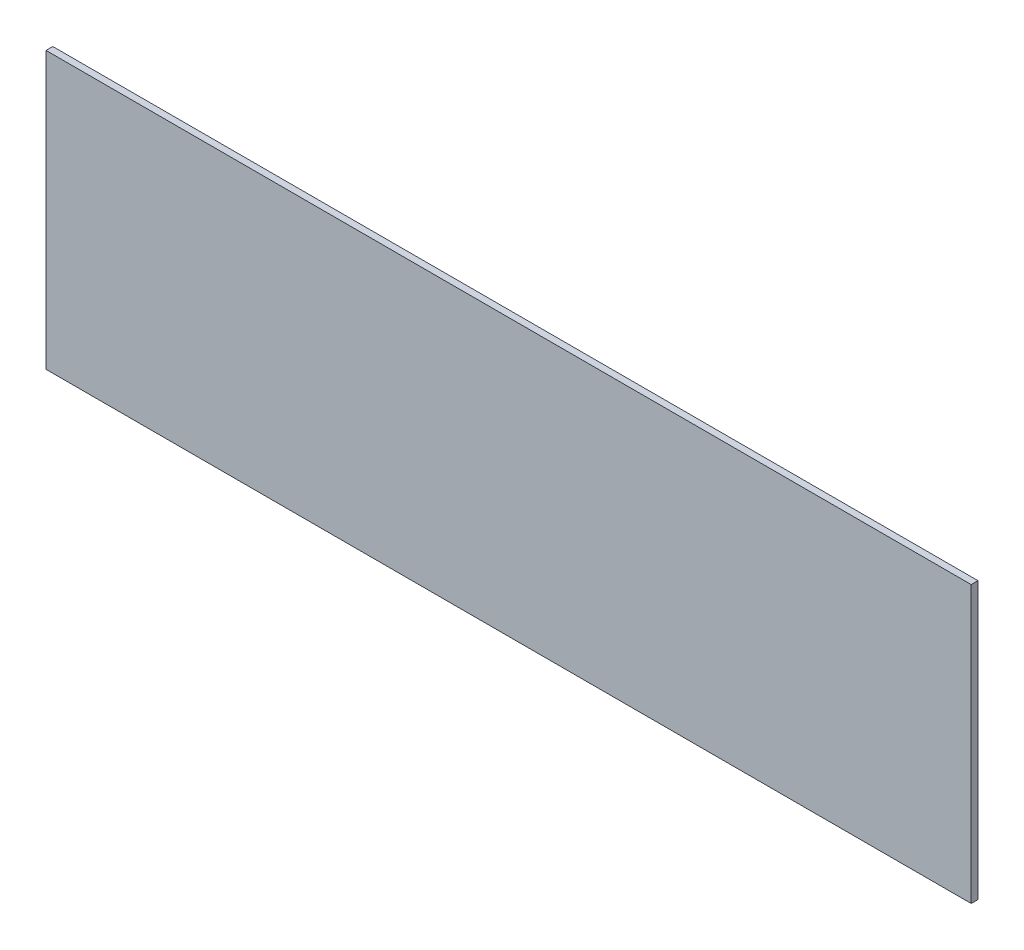
ISO-10303-21;
HEADER;
FILE_DESCRIPTION(('STEP AP214'),'2;1');
FILE_NAME('part.step','',(''),(''),'','','');
FILE_SCHEMA(('AUTOMOTIVE_DESIGN { 1 0 10303 214 1 1 1 1 }'));
ENDSEC;
DATA;
#1=APPLICATION_CONTEXT('core data for automotive mechanical design processes');
#2=APPLICATION_PROTOCOL_DEFINITION('international standard','automotive_design',2000,#1);
#3=PRODUCT_CONTEXT('',#1,'mechanical');
#4=PRODUCT('Part','Part','',(#3));
#5=PRODUCT_RELATED_PRODUCT_CATEGORY('part','',(#4));
#6=PRODUCT_DEFINITION_FORMATION('','',#4);
#7=PRODUCT_DEFINITION_CONTEXT('part definition',#1,'design');
#8=PRODUCT_DEFINITION('design','',#6,#7);
#9=PRODUCT_DEFINITION_SHAPE('','',#8);
#10=(LENGTH_UNIT() NAMED_UNIT(*) SI_UNIT(.MILLI.,.METRE.));
#11=(NAMED_UNIT(*) PLANE_ANGLE_UNIT() SI_UNIT($,.RADIAN.));
#12=(NAMED_UNIT(*) SI_UNIT($,.STERADIAN.) SOLID_ANGLE_UNIT());
#13=UNCERTAINTY_MEASURE_WITH_UNIT(LENGTH_MEASURE(1.E-05),#10,'distance_accuracy_value','');
#14=(GEOMETRIC_REPRESENTATION_CONTEXT(3) GLOBAL_UNCERTAINTY_ASSIGNED_CONTEXT((#13)) GLOBAL_UNIT_ASSIGNED_CONTEXT((#10,
#11,#12)) REPRESENTATION_CONTEXT('',''));
#15=CARTESIAN_POINT('',(0.,0.,0.));
#16=DIRECTION('',(0.,0.,1.));
#17=DIRECTION('',(1.,0.,0.));
#18=AXIS2_PLACEMENT_3D('',#15,#16,#17);
#19=CARTESIAN_POINT('',(273.,-81.5,4.));
#20=DIRECTION('',(-1.,0.,0.));
#21=DIRECTION('',(0.,0.,1.));
#22=AXIS2_PLACEMENT_3D('',#19,#20,#21);
#23=PLANE('',#22);
#24=DIRECTION('',(0.,1.,0.));
#25=VECTOR('',#24,1.);
#26=CARTESIAN_POINT('',(273.,-81.5,0.));
#27=LINE('',#26,#25);
#28=CARTESIAN_POINT('',(273.,-81.5,0.));
#29=VERTEX_POINT('',#28);
#30=CARTESIAN_POINT('',(273.,81.5,0.));
#31=VERTEX_POINT('',#30);
#32=EDGE_CURVE('E96',#29,#31,#27,.T.);
#33=ORIENTED_EDGE('',*,*,#32,.T.);
#34=DIRECTION('',(0.,0.,-1.));
#35=VECTOR('',#34,1.);
#36=CARTESIAN_POINT('',(273.,81.5,4.));
#37=LINE('',#36,#35);
#38=CARTESIAN_POINT('',(273.,81.5,4.));
#39=VERTEX_POINT('',#38);
#40=EDGE_CURVE('E11',#39,#31,#37,.T.);
#41=ORIENTED_EDGE('',*,*,#40,.F.);
#42=DIRECTION('',(0.,1.,0.));
#43=VECTOR('',#42,1.);
#44=CARTESIAN_POINT('',(273.,-81.5,4.));
#45=LINE('',#44,#43);
#46=CARTESIAN_POINT('',(273.,-81.5,4.));
#47=VERTEX_POINT('',#46);
#48=EDGE_CURVE('E84',#47,#39,#45,.T.);
#49=ORIENTED_EDGE('',*,*,#48,.F.);
#50=DIRECTION('',(0.,0.,-1.));
#51=VECTOR('',#50,1.);
#52=CARTESIAN_POINT('',(273.,-81.5,4.));
#53=LINE('',#52,#51);
#54=EDGE_CURVE('E92',#47,#29,#53,.T.);
#55=ORIENTED_EDGE('',*,*,#54,.T.);
#56=EDGE_LOOP('',(#33,#41,#49,#55));
#57=FACE_BOUND('',#56,.T.);
#58=ADVANCED_FACE('F33',(#57),#23,.F.);
#59=CARTESIAN_POINT('',(-273.,81.5,4.));
#60=DIRECTION('',(0.,-1.,0.));
#61=DIRECTION('',(0.,0.,-1.));
#62=AXIS2_PLACEMENT_3D('',#59,#60,#61);
#63=PLANE('',#62);
#64=DIRECTION('',(-1.,0.,0.));
#65=VECTOR('',#64,1.);
#66=CARTESIAN_POINT('',(-273.,81.5,0.));
#67=LINE('',#66,#65);
#68=CARTESIAN_POINT('',(-273.,81.5,0.));
#69=VERTEX_POINT('',#68);
#70=EDGE_CURVE('E88',#31,#69,#67,.T.);
#71=ORIENTED_EDGE('',*,*,#70,.T.);
#72=DIRECTION('',(0.,0.,-1.));
#73=VECTOR('',#72,1.);
#74=CARTESIAN_POINT('',(-273.,81.5,4.));
#75=LINE('',#74,#73);
#76=CARTESIAN_POINT('',(-273.,81.5,4.));
#77=VERTEX_POINT('',#76);
#78=EDGE_CURVE('E41',#77,#69,#75,.T.);
#79=ORIENTED_EDGE('',*,*,#78,.F.);
#80=DIRECTION('',(-1.,0.,0.));
#81=VECTOR('',#80,1.);
#82=CARTESIAN_POINT('',(-273.,81.5,4.));
#83=LINE('',#82,#81);
#84=EDGE_CURVE('E79',#39,#77,#83,.T.);
#85=ORIENTED_EDGE('',*,*,#84,.F.);
#86=ORIENTED_EDGE('',*,*,#40,.T.);
#87=EDGE_LOOP('',(#71,#79,#85,#86));
#88=FACE_BOUND('',#87,.T.);
#89=ADVANCED_FACE('F87',(#88),#63,.F.);
#90=CARTESIAN_POINT('',(-273.,-81.5,4.));
#91=DIRECTION('',(1.,0.,0.));
#92=DIRECTION('',(0.,0.,-1.));
#93=AXIS2_PLACEMENT_3D('',#90,#91,#92);
#94=PLANE('',#93);
#95=DIRECTION('',(0.,-1.,0.));
#96=VECTOR('',#95,1.);
#97=CARTESIAN_POINT('',(-273.,-81.5,0.));
#98=LINE('',#97,#96);
#99=CARTESIAN_POINT('',(-273.,-81.5,0.));
#100=VERTEX_POINT('',#99);
#101=EDGE_CURVE('E66',#69,#100,#98,.T.);
#102=ORIENTED_EDGE('',*,*,#101,.T.);
#103=DIRECTION('',(0.,0.,-1.));
#104=VECTOR('',#103,1.);
#105=CARTESIAN_POINT('',(-273.,-81.5,4.));
#106=LINE('',#105,#104);
#107=CARTESIAN_POINT('',(-273.,-81.5,4.));
#108=VERTEX_POINT('',#107);
#109=EDGE_CURVE('E89',#108,#100,#106,.T.);
#110=ORIENTED_EDGE('',*,*,#109,.F.);
#111=DIRECTION('',(0.,-1.,0.));
#112=VECTOR('',#111,1.);
#113=CARTESIAN_POINT('',(-273.,-81.5,4.));
#114=LINE('',#113,#112);
#115=EDGE_CURVE('E82',#77,#108,#114,.T.);
#116=ORIENTED_EDGE('',*,*,#115,.F.);
#117=ORIENTED_EDGE('',*,*,#78,.T.);
#118=EDGE_LOOP('',(#102,#110,#116,#117));
#119=FACE_BOUND('',#118,.T.);
#120=ADVANCED_FACE('F90',(#119),#94,.F.);
#121=CARTESIAN_POINT('',(-273.,-81.5,4.));
#122=DIRECTION('',(0.,1.,0.));
#123=DIRECTION('',(0.,0.,1.));
#124=AXIS2_PLACEMENT_3D('',#121,#122,#123);
#125=PLANE('',#124);
#126=DIRECTION('',(1.,0.,0.));
#127=VECTOR('',#126,1.);
#128=CARTESIAN_POINT('',(-273.,-81.5,0.));
#129=LINE('',#128,#127);
#130=EDGE_CURVE('E72',#100,#29,#129,.T.);
#131=ORIENTED_EDGE('',*,*,#130,.T.);
#132=ORIENTED_EDGE('',*,*,#54,.F.);
#133=DIRECTION('',(1.,0.,0.));
#134=VECTOR('',#133,1.);
#135=CARTESIAN_POINT('',(-273.,-81.5,4.));
#136=LINE('',#135,#134);
#137=EDGE_CURVE('E49',#108,#47,#136,.T.);
#138=ORIENTED_EDGE('',*,*,#137,.F.);
#139=ORIENTED_EDGE('',*,*,#109,.T.);
#140=EDGE_LOOP('',(#131,#132,#138,#139));
#141=FACE_BOUND('',#140,.T.);
#142=ADVANCED_FACE('F103',(#141),#125,.F.);
#143=CARTESIAN_POINT('',(0.,0.,4.));
#144=DIRECTION('',(0.,0.,-1.));
#145=DIRECTION('',(-1.,0.,0.));
#146=AXIS2_PLACEMENT_3D('',#143,#144,#145);
#147=PLANE('',#146);
#148=ORIENTED_EDGE('',*,*,#48,.T.);
#149=ORIENTED_EDGE('',*,*,#84,.T.);
#150=ORIENTED_EDGE('',*,*,#115,.T.);
#151=ORIENTED_EDGE('',*,*,#137,.T.);
#152=EDGE_LOOP('',(#148,#149,#150,#151));
#153=FACE_BOUND('',#152,.T.);
#154=ADVANCED_FACE('F80',(#153),#147,.F.);
#155=CARTESIAN_POINT('',(0.,0.,0.));
#156=DIRECTION('',(0.,0.,-1.));
#157=DIRECTION('',(-1.,0.,0.));
#158=AXIS2_PLACEMENT_3D('',#155,#156,#157);
#159=PLANE('',#158);
#160=ORIENTED_EDGE('',*,*,#32,.F.);
#161=ORIENTED_EDGE('',*,*,#130,.F.);
#162=ORIENTED_EDGE('',*,*,#101,.F.);
#163=ORIENTED_EDGE('',*,*,#70,.F.);
#164=EDGE_LOOP('',(#160,#161,#162,#163));
#165=FACE_BOUND('',#164,.T.);
#166=ADVANCED_FACE('F106',(#165),#159,.T.);
#167=CLOSED_SHELL('',(#58,#89,#120,#142,#154,#166));
#168=MANIFOLD_SOLID_BREP('B2',#167);
#169=ADVANCED_BREP_SHAPE_REPRESENTATION('',(#18,#168),#14);
#170=SHAPE_DEFINITION_REPRESENTATION(#9,#169);
ENDSEC;
END-ISO-10303-21;
